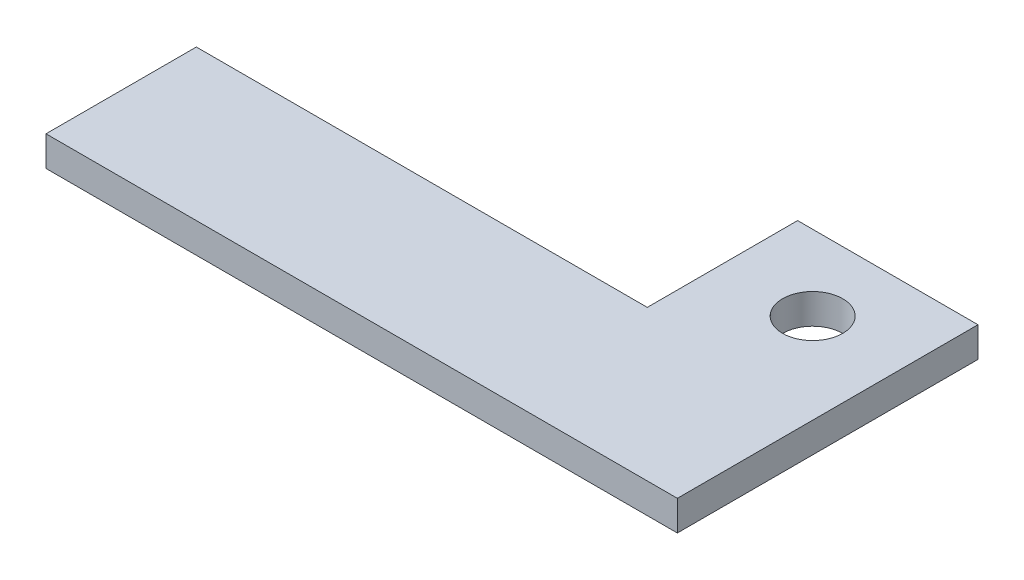
ISO-10303-21;
HEADER;
FILE_DESCRIPTION(('STEP AP214'),'2;1');
FILE_NAME('part.step','',(''),(''),'','','');
FILE_SCHEMA(('AUTOMOTIVE_DESIGN { 1 0 10303 214 1 1 1 1 }'));
ENDSEC;
DATA;
#1=APPLICATION_CONTEXT('core data for automotive mechanical design processes');
#2=APPLICATION_PROTOCOL_DEFINITION('international standard','automotive_design',2000,#1);
#3=PRODUCT_CONTEXT('',#1,'mechanical');
#4=PRODUCT('Part','Part','',(#3));
#5=PRODUCT_RELATED_PRODUCT_CATEGORY('part','',(#4));
#6=PRODUCT_DEFINITION_FORMATION('','',#4);
#7=PRODUCT_DEFINITION_CONTEXT('part definition',#1,'design');
#8=PRODUCT_DEFINITION('design','',#6,#7);
#9=PRODUCT_DEFINITION_SHAPE('','',#8);
#10=(LENGTH_UNIT() NAMED_UNIT(*) SI_UNIT(.MILLI.,.METRE.));
#11=(NAMED_UNIT(*) PLANE_ANGLE_UNIT() SI_UNIT($,.RADIAN.));
#12=(NAMED_UNIT(*) SI_UNIT($,.STERADIAN.) SOLID_ANGLE_UNIT());
#13=UNCERTAINTY_MEASURE_WITH_UNIT(LENGTH_MEASURE(1.E-05),#10,'distance_accuracy_value','');
#14=(GEOMETRIC_REPRESENTATION_CONTEXT(3) GLOBAL_UNCERTAINTY_ASSIGNED_CONTEXT((#13)) GLOBAL_UNIT_ASSIGNED_CONTEXT((#10,
#11,#12)) REPRESENTATION_CONTEXT('',''));
#15=CARTESIAN_POINT('',(0.,0.,0.));
#16=DIRECTION('',(0.,0.,1.));
#17=DIRECTION('',(1.,0.,0.));
#18=AXIS2_PLACEMENT_3D('',#15,#16,#17);
#19=CARTESIAN_POINT('',(0.,2.,0.));
#20=DIRECTION('',(0.,-1.,0.));
#21=DIRECTION('',(0.,0.,-1.));
#22=AXIS2_PLACEMENT_3D('',#19,#20,#21);
#23=PLANE('',#22);
#24=DIRECTION('',(0.,0.,-1.));
#25=VECTOR('',#24,1.);
#26=CARTESIAN_POINT('',(0.,2.,-20.));
#27=LINE('',#26,#25);
#28=CARTESIAN_POINT('',(0.,2.,0.));
#29=VERTEX_POINT('',#28);
#30=CARTESIAN_POINT('',(0.,2.,-20.));
#31=VERTEX_POINT('',#30);
#32=EDGE_CURVE('E130',#29,#31,#27,.T.);
#33=ORIENTED_EDGE('',*,*,#32,.T.);
#34=DIRECTION('',(-1.,0.,0.));
#35=VECTOR('',#34,1.);
#36=CARTESIAN_POINT('',(-12.,2.,-20.));
#37=LINE('',#36,#35);
#38=CARTESIAN_POINT('',(-12.,2.,-20.));
#39=VERTEX_POINT('',#38);
#40=EDGE_CURVE('E88',#31,#39,#37,.T.);
#41=ORIENTED_EDGE('',*,*,#40,.T.);
#42=DIRECTION('',(0.,0.,1.));
#43=VECTOR('',#42,1.);
#44=CARTESIAN_POINT('',(-12.,2.,-10.));
#45=LINE('',#44,#43);
#46=CARTESIAN_POINT('',(-12.,2.,-10.));
#47=VERTEX_POINT('',#46);
#48=EDGE_CURVE('E101',#39,#47,#45,.T.);
#49=ORIENTED_EDGE('',*,*,#48,.T.);
#50=DIRECTION('',(-1.,0.,0.));
#51=VECTOR('',#50,1.);
#52=CARTESIAN_POINT('',(-42.,2.,-9.99999999999999));
#53=LINE('',#52,#51);
#54=CARTESIAN_POINT('',(-42.,2.,-9.99999999999999));
#55=VERTEX_POINT('',#54);
#56=EDGE_CURVE('E95',#47,#55,#53,.T.);
#57=ORIENTED_EDGE('',*,*,#56,.T.);
#58=DIRECTION('',(0.,0.,1.));
#59=VECTOR('',#58,1.);
#60=CARTESIAN_POINT('',(-42.,2.,0.));
#61=LINE('',#60,#59);
#62=CARTESIAN_POINT('',(-42.,2.,0.));
#63=VERTEX_POINT('',#62);
#64=EDGE_CURVE('E99',#55,#63,#61,.T.);
#65=ORIENTED_EDGE('',*,*,#64,.T.);
#66=DIRECTION('',(1.,0.,0.));
#67=VECTOR('',#66,1.);
#68=CARTESIAN_POINT('',(0.,2.,0.));
#69=LINE('',#68,#67);
#70=EDGE_CURVE('E51',#63,#29,#69,.T.);
#71=ORIENTED_EDGE('',*,*,#70,.T.);
#72=EDGE_LOOP('',(#33,#41,#49,#57,#65,#71));
#73=FACE_BOUND('',#72,.T.);
#74=CARTESIAN_POINT('',(-6.,2.,-15.));
#75=DIRECTION('',(0.,1.,0.));
#76=DIRECTION('',(0.,0.,1.));
#77=AXIS2_PLACEMENT_3D('',#74,#75,#76);
#78=CIRCLE('',#77,2.);
#79=CARTESIAN_POINT('',(-6.,2.,-13.));
#80=VERTEX_POINT('',#79);
#81=EDGE_CURVE('E123',#80,#80,#78,.T.);
#82=ORIENTED_EDGE('',*,*,#81,.F.);
#83=EDGE_LOOP('',(#82));
#84=FACE_BOUND('',#83,.T.);
#85=ADVANCED_FACE('F34',(#73,#84),#23,.F.);
#86=CARTESIAN_POINT('',(0.,0.,0.));
#87=DIRECTION('',(0.,-1.,0.));
#88=DIRECTION('',(0.,0.,-1.));
#89=AXIS2_PLACEMENT_3D('',#86,#87,#88);
#90=PLANE('',#89);
#91=DIRECTION('',(0.,0.,-1.));
#92=VECTOR('',#91,1.);
#93=CARTESIAN_POINT('',(0.,0.,-20.));
#94=LINE('',#93,#92);
#95=CARTESIAN_POINT('',(0.,0.,0.));
#96=VERTEX_POINT('',#95);
#97=CARTESIAN_POINT('',(0.,0.,-20.));
#98=VERTEX_POINT('',#97);
#99=EDGE_CURVE('E119',#96,#98,#94,.T.);
#100=ORIENTED_EDGE('',*,*,#99,.F.);
#101=DIRECTION('',(1.,0.,0.));
#102=VECTOR('',#101,1.);
#103=CARTESIAN_POINT('',(0.,0.,0.));
#104=LINE('',#103,#102);
#105=CARTESIAN_POINT('',(-42.,0.,0.));
#106=VERTEX_POINT('',#105);
#107=EDGE_CURVE('E80',#106,#96,#104,.T.);
#108=ORIENTED_EDGE('',*,*,#107,.F.);
#109=DIRECTION('',(0.,0.,1.));
#110=VECTOR('',#109,1.);
#111=CARTESIAN_POINT('',(-42.,0.,0.));
#112=LINE('',#111,#110);
#113=CARTESIAN_POINT('',(-42.,0.,-9.99999999999999));
#114=VERTEX_POINT('',#113);
#115=EDGE_CURVE('E74',#114,#106,#112,.T.);
#116=ORIENTED_EDGE('',*,*,#115,.F.);
#117=DIRECTION('',(-1.,0.,0.));
#118=VECTOR('',#117,1.);
#119=CARTESIAN_POINT('',(-42.,0.,-9.99999999999999));
#120=LINE('',#119,#118);
#121=CARTESIAN_POINT('',(-12.,0.,-10.));
#122=VERTEX_POINT('',#121);
#123=EDGE_CURVE('E109',#122,#114,#120,.T.);
#124=ORIENTED_EDGE('',*,*,#123,.F.);
#125=DIRECTION('',(0.,0.,1.));
#126=VECTOR('',#125,1.);
#127=CARTESIAN_POINT('',(-12.,0.,-10.));
#128=LINE('',#127,#126);
#129=CARTESIAN_POINT('',(-12.,0.,-20.));
#130=VERTEX_POINT('',#129);
#131=EDGE_CURVE('E125',#130,#122,#128,.T.);
#132=ORIENTED_EDGE('',*,*,#131,.F.);
#133=DIRECTION('',(-1.,0.,0.));
#134=VECTOR('',#133,1.);
#135=CARTESIAN_POINT('',(-12.,0.,-20.));
#136=LINE('',#135,#134);
#137=EDGE_CURVE('E122',#98,#130,#136,.T.);
#138=ORIENTED_EDGE('',*,*,#137,.F.);
#139=EDGE_LOOP('',(#100,#108,#116,#124,#132,#138));
#140=FACE_BOUND('',#139,.T.);
#141=CARTESIAN_POINT('',(-6.,0.,-15.));
#142=DIRECTION('',(0.,1.,0.));
#143=DIRECTION('',(0.,0.,1.));
#144=AXIS2_PLACEMENT_3D('',#141,#142,#143);
#145=CIRCLE('',#144,2.);
#146=CARTESIAN_POINT('',(-6.,0.,-13.));
#147=VERTEX_POINT('',#146);
#148=EDGE_CURVE('E223',#147,#147,#145,.T.);
#149=ORIENTED_EDGE('',*,*,#148,.T.);
#150=EDGE_LOOP('',(#149));
#151=FACE_BOUND('',#150,.T.);
#152=ADVANCED_FACE('F139',(#140,#151),#90,.T.);
#153=CARTESIAN_POINT('',(0.,2.,-20.));
#154=DIRECTION('',(-1.,0.,0.));
#155=DIRECTION('',(0.,0.,1.));
#156=AXIS2_PLACEMENT_3D('',#153,#154,#155);
#157=PLANE('',#156);
#158=ORIENTED_EDGE('',*,*,#99,.T.);
#159=DIRECTION('',(0.,-1.,0.));
#160=VECTOR('',#159,1.);
#161=CARTESIAN_POINT('',(0.,2.,-20.));
#162=LINE('',#161,#160);
#163=EDGE_CURVE('E11',#31,#98,#162,.T.);
#164=ORIENTED_EDGE('',*,*,#163,.F.);
#165=ORIENTED_EDGE('',*,*,#32,.F.);
#166=DIRECTION('',(0.,-1.,0.));
#167=VECTOR('',#166,1.);
#168=CARTESIAN_POINT('',(0.,2.,0.));
#169=LINE('',#168,#167);
#170=EDGE_CURVE('E115',#29,#96,#169,.T.);
#171=ORIENTED_EDGE('',*,*,#170,.T.);
#172=EDGE_LOOP('',(#158,#164,#165,#171));
#173=FACE_BOUND('',#172,.T.);
#174=ADVANCED_FACE('F36',(#173),#157,.F.);
#175=CARTESIAN_POINT('',(-12.,2.,-20.));
#176=DIRECTION('',(0.,0.,1.));
#177=DIRECTION('',(1.,0.,0.));
#178=AXIS2_PLACEMENT_3D('',#175,#176,#177);
#179=PLANE('',#178);
#180=ORIENTED_EDGE('',*,*,#137,.T.);
#181=DIRECTION('',(0.,-1.,0.));
#182=VECTOR('',#181,1.);
#183=CARTESIAN_POINT('',(-12.,2.,-20.));
#184=LINE('',#183,#182);
#185=EDGE_CURVE('E43',#39,#130,#184,.T.);
#186=ORIENTED_EDGE('',*,*,#185,.F.);
#187=ORIENTED_EDGE('',*,*,#40,.F.);
#188=ORIENTED_EDGE('',*,*,#163,.T.);
#189=EDGE_LOOP('',(#180,#186,#187,#188));
#190=FACE_BOUND('',#189,.T.);
#191=ADVANCED_FACE('F164',(#190),#179,.F.);
#192=CARTESIAN_POINT('',(-12.,2.,-10.));
#193=DIRECTION('',(1.,0.,0.));
#194=DIRECTION('',(0.,0.,-1.));
#195=AXIS2_PLACEMENT_3D('',#192,#193,#194);
#196=PLANE('',#195);
#197=ORIENTED_EDGE('',*,*,#131,.T.);
#198=DIRECTION('',(0.,-1.,0.));
#199=VECTOR('',#198,1.);
#200=CARTESIAN_POINT('',(-12.,2.,-10.));
#201=LINE('',#200,#199);
#202=EDGE_CURVE('E110',#47,#122,#201,.T.);
#203=ORIENTED_EDGE('',*,*,#202,.F.);
#204=ORIENTED_EDGE('',*,*,#48,.F.);
#205=ORIENTED_EDGE('',*,*,#185,.T.);
#206=EDGE_LOOP('',(#197,#203,#204,#205));
#207=FACE_BOUND('',#206,.T.);
#208=ADVANCED_FACE('F136',(#207),#196,.F.);
#209=CARTESIAN_POINT('',(-42.,2.,-9.99999999999999));
#210=DIRECTION('',(0.,0.,1.));
#211=DIRECTION('',(1.,0.,0.));
#212=AXIS2_PLACEMENT_3D('',#209,#210,#211);
#213=PLANE('',#212);
#214=ORIENTED_EDGE('',*,*,#123,.T.);
#215=DIRECTION('',(0.,-1.,0.));
#216=VECTOR('',#215,1.);
#217=CARTESIAN_POINT('',(-42.,2.,-9.99999999999999));
#218=LINE('',#217,#216);
#219=EDGE_CURVE('E106',#55,#114,#218,.T.);
#220=ORIENTED_EDGE('',*,*,#219,.F.);
#221=ORIENTED_EDGE('',*,*,#56,.F.);
#222=ORIENTED_EDGE('',*,*,#202,.T.);
#223=EDGE_LOOP('',(#214,#220,#221,#222));
#224=FACE_BOUND('',#223,.T.);
#225=ADVANCED_FACE('F107',(#224),#213,.F.);
#226=CARTESIAN_POINT('',(-42.,2.,0.));
#227=DIRECTION('',(1.,0.,0.));
#228=DIRECTION('',(0.,0.,-1.));
#229=AXIS2_PLACEMENT_3D('',#226,#227,#228);
#230=PLANE('',#229);
#231=ORIENTED_EDGE('',*,*,#115,.T.);
#232=DIRECTION('',(0.,-1.,0.));
#233=VECTOR('',#232,1.);
#234=CARTESIAN_POINT('',(-42.,2.,0.));
#235=LINE('',#234,#233);
#236=EDGE_CURVE('E111',#63,#106,#235,.T.);
#237=ORIENTED_EDGE('',*,*,#236,.F.);
#238=ORIENTED_EDGE('',*,*,#64,.F.);
#239=ORIENTED_EDGE('',*,*,#219,.T.);
#240=EDGE_LOOP('',(#231,#237,#238,#239));
#241=FACE_BOUND('',#240,.T.);
#242=ADVANCED_FACE('F113',(#241),#230,.F.);
#243=CARTESIAN_POINT('',(0.,2.,0.));
#244=DIRECTION('',(0.,0.,-1.));
#245=DIRECTION('',(-1.,0.,0.));
#246=AXIS2_PLACEMENT_3D('',#243,#244,#245);
#247=PLANE('',#246);
#248=ORIENTED_EDGE('',*,*,#107,.T.);
#249=ORIENTED_EDGE('',*,*,#170,.F.);
#250=ORIENTED_EDGE('',*,*,#70,.F.);
#251=ORIENTED_EDGE('',*,*,#236,.T.);
#252=EDGE_LOOP('',(#248,#249,#250,#251));
#253=FACE_BOUND('',#252,.T.);
#254=ADVANCED_FACE('F144',(#253),#247,.F.);
#255=CARTESIAN_POINT('',(-6.,2.,-15.));
#256=DIRECTION('',(0.,-1.,0.));
#257=DIRECTION('',(0.,0.,-1.));
#258=AXIS2_PLACEMENT_3D('',#255,#256,#257);
#259=CYLINDRICAL_SURFACE('',#258,2.);
#260=ORIENTED_EDGE('',*,*,#81,.T.);
#261=EDGE_LOOP('',(#260));
#262=FACE_BOUND('',#261,.T.);
#263=ORIENTED_EDGE('',*,*,#148,.F.);
#264=EDGE_LOOP('',(#263));
#265=FACE_BOUND('',#264,.T.);
#266=ADVANCED_FACE('F146',(#262,#265),#259,.F.);
#267=CLOSED_SHELL('',(#85,#152,#174,#191,#208,#225,#242,#254,#266));
#268=MANIFOLD_SOLID_BREP('B2',#267);
#269=ADVANCED_BREP_SHAPE_REPRESENTATION('',(#18,#268),#14);
#270=SHAPE_DEFINITION_REPRESENTATION(#9,#269);
ENDSEC;
END-ISO-10303-21;
